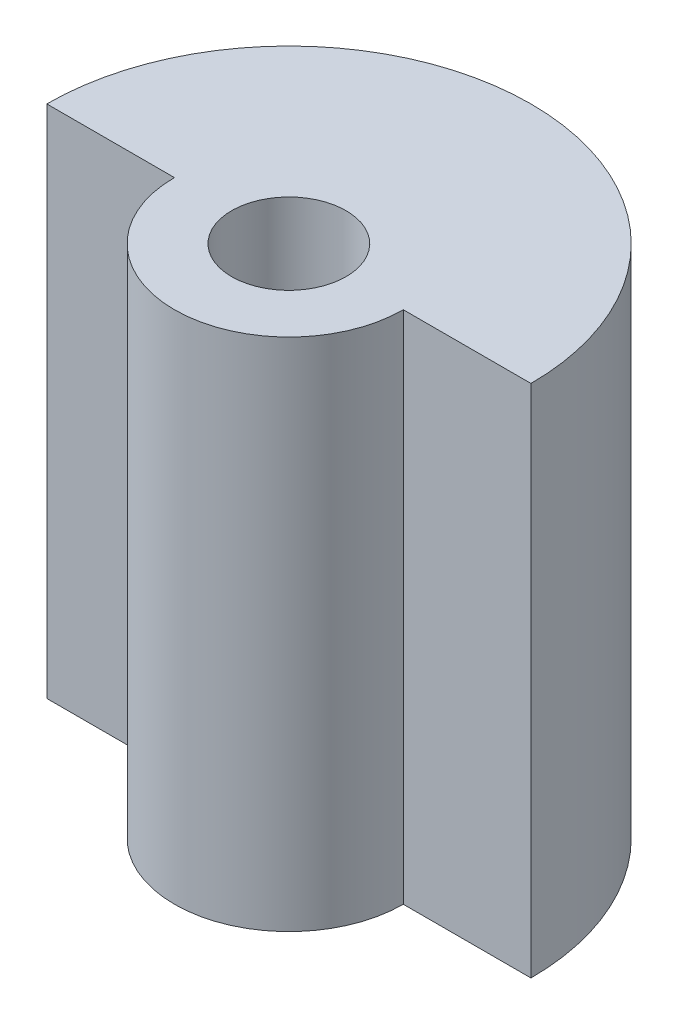
ISO-10303-21;
HEADER;
FILE_DESCRIPTION(('STEP AP214'),'2;1');
FILE_NAME('part.step','',(''),(''),'','','');
FILE_SCHEMA(('AUTOMOTIVE_DESIGN { 1 0 10303 214 1 1 1 1 }'));
ENDSEC;
DATA;
#1=APPLICATION_CONTEXT('core data for automotive mechanical design processes');
#2=APPLICATION_PROTOCOL_DEFINITION('international standard','automotive_design',2000,#1);
#3=PRODUCT_CONTEXT('',#1,'mechanical');
#4=PRODUCT('Part','Part','',(#3));
#5=PRODUCT_RELATED_PRODUCT_CATEGORY('part','',(#4));
#6=PRODUCT_DEFINITION_FORMATION('','',#4);
#7=PRODUCT_DEFINITION_CONTEXT('part definition',#1,'design');
#8=PRODUCT_DEFINITION('design','',#6,#7);
#9=PRODUCT_DEFINITION_SHAPE('','',#8);
#10=(LENGTH_UNIT() NAMED_UNIT(*) SI_UNIT(.MILLI.,.METRE.));
#11=(NAMED_UNIT(*) PLANE_ANGLE_UNIT() SI_UNIT($,.RADIAN.));
#12=(NAMED_UNIT(*) SI_UNIT($,.STERADIAN.) SOLID_ANGLE_UNIT());
#13=UNCERTAINTY_MEASURE_WITH_UNIT(LENGTH_MEASURE(1.E-05),#10,'distance_accuracy_value','');
#14=(GEOMETRIC_REPRESENTATION_CONTEXT(3) GLOBAL_UNCERTAINTY_ASSIGNED_CONTEXT((#13)) GLOBAL_UNIT_ASSIGNED_CONTEXT((#10,
#11,#12)) REPRESENTATION_CONTEXT('',''));
#15=CARTESIAN_POINT('',(0.,0.,0.));
#16=DIRECTION('',(0.,0.,1.));
#17=DIRECTION('',(1.,0.,0.));
#18=AXIS2_PLACEMENT_3D('',#15,#16,#17);
#19=CARTESIAN_POINT('',(0.,4.5,0.));
#20=DIRECTION('',(0.,-1.,0.));
#21=DIRECTION('',(0.,0.,-1.));
#22=AXIS2_PLACEMENT_3D('',#19,#20,#21);
#23=CYLINDRICAL_SURFACE('',#22,2.11569943515423);
#24=CARTESIAN_POINT('',(0.,0.,0.));
#25=DIRECTION('',(0.,1.,0.));
#26=DIRECTION('',(0.,0.,1.));
#27=AXIS2_PLACEMENT_3D('',#24,#25,#26);
#28=CIRCLE('',#27,2.11569943515423);
#29=CARTESIAN_POINT('',(2.11569943515423,0.,0.));
#30=VERTEX_POINT('',#29);
#31=CARTESIAN_POINT('',(-2.11569943515423,0.,0.));
#32=VERTEX_POINT('',#31);
#33=EDGE_CURVE('E99',#30,#32,#28,.T.);
#34=ORIENTED_EDGE('',*,*,#33,.T.);
#35=DIRECTION('',(0.,-1.,0.));
#36=VECTOR('',#35,1.);
#37=CARTESIAN_POINT('',(-2.11569943515423,4.5,0.));
#38=LINE('',#37,#36);
#39=CARTESIAN_POINT('',(-2.11569943515423,4.5,0.));
#40=VERTEX_POINT('',#39);
#41=EDGE_CURVE('E11',#40,#32,#38,.T.);
#42=ORIENTED_EDGE('',*,*,#41,.F.);
#43=CARTESIAN_POINT('',(0.,4.5,0.));
#44=DIRECTION('',(0.,1.,0.));
#45=DIRECTION('',(0.,0.,1.));
#46=AXIS2_PLACEMENT_3D('',#43,#44,#45);
#47=CIRCLE('',#46,2.11569943515423);
#48=CARTESIAN_POINT('',(2.11569943515423,4.5,0.));
#49=VERTEX_POINT('',#48);
#50=EDGE_CURVE('E87',#49,#40,#47,.T.);
#51=ORIENTED_EDGE('',*,*,#50,.F.);
#52=DIRECTION('',(0.,-1.,0.));
#53=VECTOR('',#52,1.);
#54=CARTESIAN_POINT('',(2.11569943515423,4.5,0.));
#55=LINE('',#54,#53);
#56=EDGE_CURVE('E95',#49,#30,#55,.T.);
#57=ORIENTED_EDGE('',*,*,#56,.T.);
#58=EDGE_LOOP('',(#34,#42,#51,#57));
#59=FACE_BOUND('',#58,.T.);
#60=ADVANCED_FACE('F36',(#59),#23,.T.);
#61=CARTESIAN_POINT('',(-2.11569943515423,4.5,0.));
#62=DIRECTION('',(0.,0.,-1.));
#63=DIRECTION('',(-1.,0.,0.));
#64=AXIS2_PLACEMENT_3D('',#61,#62,#63);
#65=PLANE('',#64);
#66=DIRECTION('',(1.,0.,0.));
#67=VECTOR('',#66,1.);
#68=CARTESIAN_POINT('',(-2.11569943515423,0.,0.));
#69=LINE('',#68,#67);
#70=CARTESIAN_POINT('',(-1.,0.,0.));
#71=VERTEX_POINT('',#70);
#72=EDGE_CURVE('E91',#32,#71,#69,.T.);
#73=ORIENTED_EDGE('',*,*,#72,.T.);
#74=DIRECTION('',(0.,-1.,0.));
#75=VECTOR('',#74,1.);
#76=CARTESIAN_POINT('',(-1.,4.5,0.));
#77=LINE('',#76,#75);
#78=CARTESIAN_POINT('',(-1.,4.5,0.));
#79=VERTEX_POINT('',#78);
#80=EDGE_CURVE('E44',#79,#71,#77,.T.);
#81=ORIENTED_EDGE('',*,*,#80,.F.);
#82=DIRECTION('',(1.,0.,0.));
#83=VECTOR('',#82,1.);
#84=CARTESIAN_POINT('',(-2.11569943515423,4.5,0.));
#85=LINE('',#84,#83);
#86=EDGE_CURVE('E82',#40,#79,#85,.T.);
#87=ORIENTED_EDGE('',*,*,#86,.F.);
#88=ORIENTED_EDGE('',*,*,#41,.T.);
#89=EDGE_LOOP('',(#73,#81,#87,#88));
#90=FACE_BOUND('',#89,.T.);
#91=ADVANCED_FACE('F90',(#90),#65,.F.);
#92=CARTESIAN_POINT('',(0.,4.5,0.));
#93=DIRECTION('',(0.,-1.,0.));
#94=DIRECTION('',(0.,0.,-1.));
#95=AXIS2_PLACEMENT_3D('',#92,#93,#94);
#96=CYLINDRICAL_SURFACE('',#95,1.);
#97=CARTESIAN_POINT('',(0.,0.,0.));
#98=DIRECTION('',(0.,1.,0.));
#99=DIRECTION('',(0.,0.,1.));
#100=AXIS2_PLACEMENT_3D('',#97,#98,#99);
#101=CIRCLE('',#100,1.);
#102=CARTESIAN_POINT('',(1.,0.,0.));
#103=VERTEX_POINT('',#102);
#104=EDGE_CURVE('E69',#71,#103,#101,.T.);
#105=ORIENTED_EDGE('',*,*,#104,.T.);
#106=DIRECTION('',(0.,-1.,0.));
#107=VECTOR('',#106,1.);
#108=CARTESIAN_POINT('',(1.,4.5,0.));
#109=LINE('',#108,#107);
#110=CARTESIAN_POINT('',(1.,4.5,0.));
#111=VERTEX_POINT('',#110);
#112=EDGE_CURVE('E92',#111,#103,#109,.T.);
#113=ORIENTED_EDGE('',*,*,#112,.F.);
#114=CARTESIAN_POINT('',(0.,4.5,0.));
#115=DIRECTION('',(0.,1.,0.));
#116=DIRECTION('',(0.,0.,1.));
#117=AXIS2_PLACEMENT_3D('',#114,#115,#116);
#118=CIRCLE('',#117,1.);
#119=EDGE_CURVE('E85',#79,#111,#118,.T.);
#120=ORIENTED_EDGE('',*,*,#119,.F.);
#121=ORIENTED_EDGE('',*,*,#80,.T.);
#122=EDGE_LOOP('',(#105,#113,#120,#121));
#123=FACE_BOUND('',#122,.T.);
#124=ADVANCED_FACE('F93',(#123),#96,.T.);
#125=CARTESIAN_POINT('',(1.,4.5,0.));
#126=DIRECTION('',(0.,0.,-1.));
#127=DIRECTION('',(-1.,0.,0.));
#128=AXIS2_PLACEMENT_3D('',#125,#126,#127);
#129=PLANE('',#128);
#130=DIRECTION('',(1.,0.,0.));
#131=VECTOR('',#130,1.);
#132=CARTESIAN_POINT('',(1.,0.,0.));
#133=LINE('',#132,#131);
#134=EDGE_CURVE('E75',#103,#30,#133,.T.);
#135=ORIENTED_EDGE('',*,*,#134,.T.);
#136=ORIENTED_EDGE('',*,*,#56,.F.);
#137=DIRECTION('',(1.,0.,0.));
#138=VECTOR('',#137,1.);
#139=CARTESIAN_POINT('',(1.,4.5,0.));
#140=LINE('',#139,#138);
#141=EDGE_CURVE('E52',#111,#49,#140,.T.);
#142=ORIENTED_EDGE('',*,*,#141,.F.);
#143=ORIENTED_EDGE('',*,*,#112,.T.);
#144=EDGE_LOOP('',(#135,#136,#142,#143));
#145=FACE_BOUND('',#144,.T.);
#146=ADVANCED_FACE('F107',(#145),#129,.F.);
#147=CARTESIAN_POINT('',(0.,4.5,0.));
#148=DIRECTION('',(0.,1.,0.));
#149=DIRECTION('',(0.,0.,1.));
#150=AXIS2_PLACEMENT_3D('',#147,#148,#149);
#151=PLANE('',#150);
#152=CARTESIAN_POINT('',(0.,4.5,0.));
#153=DIRECTION('',(0.,1.,0.));
#154=DIRECTION('',(0.,0.,1.));
#155=AXIS2_PLACEMENT_3D('',#152,#153,#154);
#156=CIRCLE('',#155,0.5);
#157=CARTESIAN_POINT('',(0.,4.5,0.5));
#158=VERTEX_POINT('',#157);
#159=EDGE_CURVE('E113',#158,#158,#156,.T.);
#160=ORIENTED_EDGE('',*,*,#159,.F.);
#161=EDGE_LOOP('',(#160));
#162=FACE_BOUND('',#161,.T.);
#163=ORIENTED_EDGE('',*,*,#50,.T.);
#164=ORIENTED_EDGE('',*,*,#86,.T.);
#165=ORIENTED_EDGE('',*,*,#119,.T.);
#166=ORIENTED_EDGE('',*,*,#141,.T.);
#167=EDGE_LOOP('',(#163,#164,#165,#166));
#168=FACE_BOUND('',#167,.T.);
#169=ADVANCED_FACE('F83',(#162,#168),#151,.T.);
#170=CARTESIAN_POINT('',(0.,0.,0.));
#171=DIRECTION('',(0.,1.,0.));
#172=DIRECTION('',(0.,0.,1.));
#173=AXIS2_PLACEMENT_3D('',#170,#171,#172);
#174=PLANE('',#173);
#175=CARTESIAN_POINT('',(0.,0.,0.));
#176=DIRECTION('',(0.,1.,0.));
#177=DIRECTION('',(0.,0.,1.));
#178=AXIS2_PLACEMENT_3D('',#175,#176,#177);
#179=CIRCLE('',#178,0.5);
#180=CARTESIAN_POINT('',(0.,0.,0.5));
#181=VERTEX_POINT('',#180);
#182=EDGE_CURVE('E102',#181,#181,#179,.T.);
#183=ORIENTED_EDGE('',*,*,#182,.T.);
#184=EDGE_LOOP('',(#183));
#185=FACE_BOUND('',#184,.T.);
#186=ORIENTED_EDGE('',*,*,#33,.F.);
#187=ORIENTED_EDGE('',*,*,#134,.F.);
#188=ORIENTED_EDGE('',*,*,#104,.F.);
#189=ORIENTED_EDGE('',*,*,#72,.F.);
#190=EDGE_LOOP('',(#186,#187,#188,#189));
#191=FACE_BOUND('',#190,.T.);
#192=ADVANCED_FACE('F110',(#185,#191),#174,.F.);
#193=CARTESIAN_POINT('',(0.,0.,0.));
#194=DIRECTION('',(0.,1.,0.));
#195=DIRECTION('',(0.,0.,1.));
#196=AXIS2_PLACEMENT_3D('',#193,#194,#195);
#197=CYLINDRICAL_SURFACE('',#196,0.5);
#198=ORIENTED_EDGE('',*,*,#182,.F.);
#199=EDGE_LOOP('',(#198));
#200=FACE_BOUND('',#199,.T.);
#201=ORIENTED_EDGE('',*,*,#159,.T.);
#202=EDGE_LOOP('',(#201));
#203=FACE_BOUND('',#202,.T.);
#204=ADVANCED_FACE('F120',(#200,#203),#197,.F.);
#205=CLOSED_SHELL('',(#60,#91,#124,#146,#169,#192,#204));
#206=MANIFOLD_SOLID_BREP('B2',#205);
#207=ADVANCED_BREP_SHAPE_REPRESENTATION('',(#18,#206),#14);
#208=SHAPE_DEFINITION_REPRESENTATION(#9,#207);
ENDSEC;
END-ISO-10303-21;
